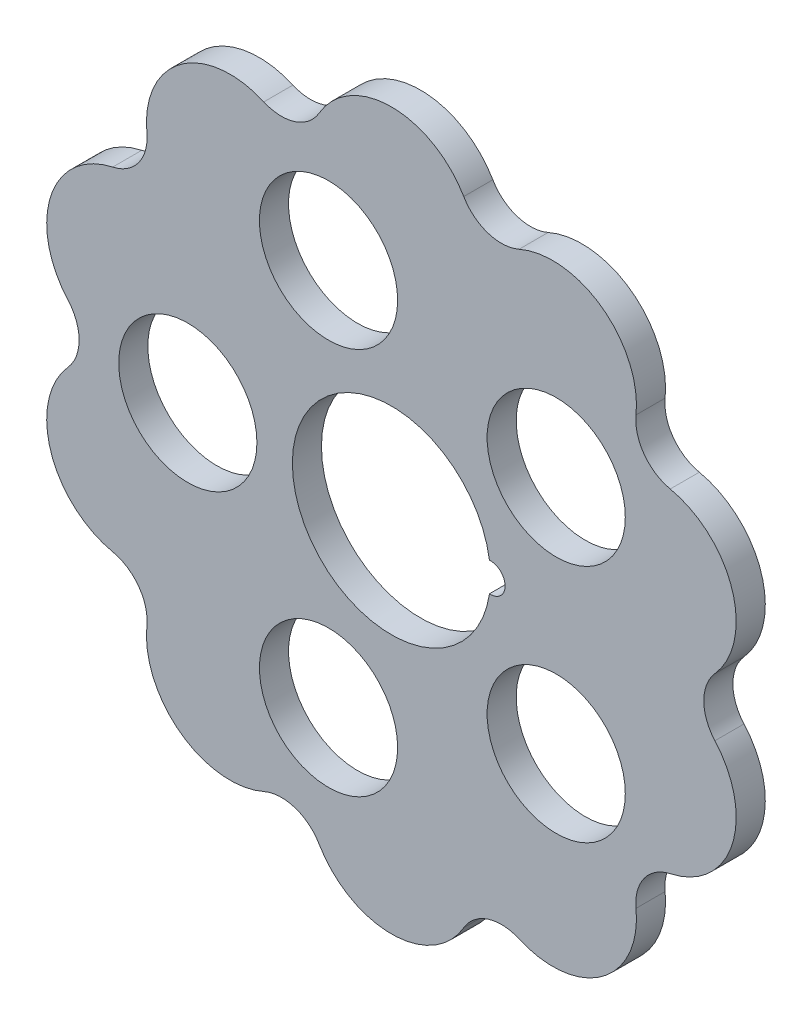
ISO-10303-21;
HEADER;
FILE_DESCRIPTION(('STEP AP214'),'2;1');
FILE_NAME('part.step','',(''),(''),'','','');
FILE_SCHEMA(('AUTOMOTIVE_DESIGN { 1 0 10303 214 1 1 1 1 }'));
ENDSEC;
DATA;
#1=APPLICATION_CONTEXT('core data for automotive mechanical design processes');
#2=APPLICATION_PROTOCOL_DEFINITION('international standard','automotive_design',2000,#1);
#3=PRODUCT_CONTEXT('',#1,'mechanical');
#4=PRODUCT('Part','Part','',(#3));
#5=PRODUCT_RELATED_PRODUCT_CATEGORY('part','',(#4));
#6=PRODUCT_DEFINITION_FORMATION('','',#4);
#7=PRODUCT_DEFINITION_CONTEXT('part definition',#1,'design');
#8=PRODUCT_DEFINITION('design','',#6,#7);
#9=PRODUCT_DEFINITION_SHAPE('','',#8);
#10=(LENGTH_UNIT() NAMED_UNIT(*) SI_UNIT(.MILLI.,.METRE.));
#11=(NAMED_UNIT(*) PLANE_ANGLE_UNIT() SI_UNIT($,.RADIAN.));
#12=(NAMED_UNIT(*) SI_UNIT($,.STERADIAN.) SOLID_ANGLE_UNIT());
#13=UNCERTAINTY_MEASURE_WITH_UNIT(LENGTH_MEASURE(1.E-05),#10,'distance_accuracy_value','');
#14=(GEOMETRIC_REPRESENTATION_CONTEXT(3) GLOBAL_UNCERTAINTY_ASSIGNED_CONTEXT((#13)) GLOBAL_UNIT_ASSIGNED_CONTEXT((#10,
#11,#12)) REPRESENTATION_CONTEXT('',''));
#15=CARTESIAN_POINT('',(0.,0.,0.));
#16=DIRECTION('',(0.,0.,1.));
#17=DIRECTION('',(1.,0.,0.));
#18=AXIS2_PLACEMENT_3D('',#15,#16,#17);
#19=CARTESIAN_POINT('',(-7.562766619413,-35.3384152774416,4.));
#20=DIRECTION('',(0.,0.,-1.));
#21=DIRECTION('',(-1.,0.,0.));
#22=AXIS2_PLACEMENT_3D('',#19,#20,#21);
#23=PLANE('',#22);
#24=CARTESIAN_POINT('',(-15.125533238826,-39.7392175975071,4.));
#25=DIRECTION('',(0.,0.,-1.));
#26=DIRECTION('',(-1.,0.,0.));
#27=AXIS2_PLACEMENT_3D('',#24,#25,#26);
#28=CIRCLE('',#27,5.99999999999993);
#29=CARTESIAN_POINT('',(-17.5472566794711,-34.2496588195152,4.));
#30=VERTEX_POINT('',#29);
#31=CARTESIAN_POINT('',(-9.93963612837122,-36.7215245780338,4.));
#32=VERTEX_POINT('',#31);
#33=EDGE_CURVE('E256',#30,#32,#28,.T.);
#34=ORIENTED_EDGE('',*,*,#33,.T.);
#35=CARTESIAN_POINT('',(0.,-30.9376129573762,4.));
#36=DIRECTION('',(0.,0.,1.));
#37=DIRECTION('',(1.,0.,0.));
#38=AXIS2_PLACEMENT_3D('',#35,#36,#37);
#39=CIRCLE('',#38,11.5);
#40=CARTESIAN_POINT('',(9.93963612837114,-36.7215245780338,4.));
#41=VERTEX_POINT('',#40);
#42=EDGE_CURVE('E137',#32,#41,#39,.T.);
#43=ORIENTED_EDGE('',*,*,#42,.T.);
#44=CARTESIAN_POINT('',(15.1255332388255,-39.7392175975072,4.));
#45=DIRECTION('',(0.,0.,-1.));
#46=DIRECTION('',(-1.,0.,0.));
#47=AXIS2_PLACEMENT_3D('',#44,#45,#46);
#48=CIRCLE('',#47,5.9999999999998);
#49=CARTESIAN_POINT('',(17.5472566794707,-34.2496588195154,4.));
#50=VERTEX_POINT('',#49);
#51=EDGE_CURVE('E335',#41,#50,#48,.T.);
#52=ORIENTED_EDGE('',*,*,#51,.T.);
#53=CARTESIAN_POINT('',(22.1888932740404,-23.7280044950307,4.));
#54=DIRECTION('',(0.,0.,1.));
#55=DIRECTION('',(1.,0.,0.));
#56=AXIS2_PLACEMENT_3D('',#53,#54,#55);
#57=CIRCLE('',#56,11.4999999999999);
#58=CARTESIAN_POINT('',(33.6299257709814,-22.5649157606956,4.));
#59=VERTEX_POINT('',#58);
#60=EDGE_CURVE('E337',#50,#59,#57,.T.);
#61=ORIENTED_EDGE('',*,*,#60,.T.);
#62=CARTESIAN_POINT('',(39.5991601172115,-21.9580868558251,4.));
#63=DIRECTION('',(0.,0.,-1.));
#64=DIRECTION('',(-1.,0.,0.));
#65=AXIS2_PLACEMENT_3D('',#62,#63,#64);
#66=CIRCLE('',#65,5.99999999999993);
#67=CARTESIAN_POINT('',(38.3316938450736,-16.0934871892671,4.));
#68=VERTEX_POINT('',#67);
#69=EDGE_CURVE('E339',#59,#68,#66,.T.);
#70=ORIENTED_EDGE('',*,*,#69,.T.);
#71=CARTESIAN_POINT('',(35.9023834901419,-4.85300449503085,4.));
#72=DIRECTION('',(0.,0.,1.));
#73=DIRECTION('',(1.,0.,0.));
#74=AXIS2_PLACEMENT_3D('',#71,#72,#73);
#75=CIRCLE('',#74,11.5);
#76=CARTESIAN_POINT('',(44.4747268082136,2.81282422971325,4.));
#77=VERTEX_POINT('',#76);
#78=EDGE_CURVE('E341',#68,#77,#75,.T.);
#79=ORIENTED_EDGE('',*,*,#78,.T.);
#80=CARTESIAN_POINT('',(48.9472537567725,6.81238704262311,4.));
#81=DIRECTION('',(0.,0.,-1.));
#82=DIRECTION('',(-1.,0.,0.));
#83=AXIS2_PLACEMENT_3D('',#80,#81,#82);
#84=CIRCLE('',#83,5.99999999999993);
#85=CARTESIAN_POINT('',(44.4747268082138,10.8119498555334,4.));
#86=VERTEX_POINT('',#85);
#87=EDGE_CURVE('E343',#77,#86,#84,.T.);
#88=ORIENTED_EDGE('',*,*,#87,.T.);
#89=CARTESIAN_POINT('',(35.9023834901421,18.4777785802777,4.));
#90=DIRECTION('',(0.,0.,1.));
#91=DIRECTION('',(1.,0.,0.));
#92=AXIS2_PLACEMENT_3D('',#89,#90,#91);
#93=CIRCLE('',#92,11.5);
#94=CARTESIAN_POINT('',(38.331693845074,29.7182612745138,4.));
#95=VERTEX_POINT('',#94);
#96=EDGE_CURVE('E345',#86,#95,#93,.T.);
#97=ORIENTED_EDGE('',*,*,#96,.T.);
#98=CARTESIAN_POINT('',(39.5991601172123,35.5828609410716,4.));
#99=DIRECTION('',(0.,0.,-1.));
#100=DIRECTION('',(-1.,0.,0.));
#101=AXIS2_PLACEMENT_3D('',#98,#99,#100);
#102=CIRCLE('',#101,5.99999999999992);
#103=CARTESIAN_POINT('',(33.6299257709823,36.1896898459425,4.));
#104=VERTEX_POINT('',#103);
#105=EDGE_CURVE('E347',#95,#104,#102,.T.);
#106=ORIENTED_EDGE('',*,*,#105,.T.);
#107=CARTESIAN_POINT('',(22.1888932740411,37.3527785802779,4.));
#108=DIRECTION('',(0.,0.,1.));
#109=DIRECTION('',(1.,0.,0.));
#110=AXIS2_PLACEMENT_3D('',#107,#108,#109);
#111=CIRCLE('',#110,11.5);
#112=CARTESIAN_POINT('',(17.5472566794713,47.8744329047627,4.));
#113=VERTEX_POINT('',#112);
#114=EDGE_CURVE('E349',#104,#113,#111,.T.);
#115=ORIENTED_EDGE('',*,*,#114,.T.);
#116=CARTESIAN_POINT('',(15.1255332388262,53.3639916827546,4.));
#117=DIRECTION('',(0.,0.,-1.));
#118=DIRECTION('',(-1.,0.,0.));
#119=AXIS2_PLACEMENT_3D('',#116,#117,#118);
#120=CIRCLE('',#119,5.99999999999993);
#121=CARTESIAN_POINT('',(9.93963612837156,50.3462986632815,4.));
#122=VERTEX_POINT('',#121);
#123=EDGE_CURVE('E351',#113,#122,#120,.T.);
#124=ORIENTED_EDGE('',*,*,#123,.T.);
#125=CARTESIAN_POINT('',(2.2891237156312E-13,44.5623870426238,4.));
#126=DIRECTION('',(0.,0.,1.));
#127=DIRECTION('',(1.,0.,0.));
#128=AXIS2_PLACEMENT_3D('',#125,#126,#127);
#129=CIRCLE('',#128,11.5);
#130=CARTESIAN_POINT('',(-9.93963612837091,50.3462986632815,4.));
#131=VERTEX_POINT('',#130);
#132=EDGE_CURVE('E353',#122,#131,#129,.T.);
#133=ORIENTED_EDGE('',*,*,#132,.T.);
#134=CARTESIAN_POINT('',(-15.1255332388253,53.363991682755,4.));
#135=DIRECTION('',(0.,0.,-1.));
#136=DIRECTION('',(-1.,0.,0.));
#137=AXIS2_PLACEMENT_3D('',#134,#135,#136);
#138=CIRCLE('',#137,5.99999999999992);
#139=CARTESIAN_POINT('',(-17.5472566794707,47.8744329047631,4.));
#140=VERTEX_POINT('',#139);
#141=EDGE_CURVE('E355',#131,#140,#138,.T.);
#142=ORIENTED_EDGE('',*,*,#141,.T.);
#143=CARTESIAN_POINT('',(-22.1888932740407,37.3527785802782,4.));
#144=DIRECTION('',(0.,0.,1.));
#145=DIRECTION('',(1.,0.,0.));
#146=AXIS2_PLACEMENT_3D('',#143,#144,#145);
#147=CIRCLE('',#146,11.5);
#148=CARTESIAN_POINT('',(-33.6299257709818,36.189689845943,4.));
#149=VERTEX_POINT('',#148);
#150=EDGE_CURVE('E357',#140,#149,#147,.T.);
#151=ORIENTED_EDGE('',*,*,#150,.T.);
#152=CARTESIAN_POINT('',(-39.5991601172118,35.5828609410724,4.));
#153=DIRECTION('',(0.,0.,-1.));
#154=DIRECTION('',(-1.,0.,0.));
#155=AXIS2_PLACEMENT_3D('',#152,#153,#154);
#156=CIRCLE('',#155,5.99999999999992);
#157=CARTESIAN_POINT('',(-38.3316938450738,29.7182612745145,4.));
#158=VERTEX_POINT('',#157);
#159=EDGE_CURVE('E359',#149,#158,#156,.T.);
#160=ORIENTED_EDGE('',*,*,#159,.T.);
#161=CARTESIAN_POINT('',(-35.902383490142,18.4777785802783,4.));
#162=DIRECTION('',(0.,0.,1.));
#163=DIRECTION('',(1.,0.,0.));
#164=AXIS2_PLACEMENT_3D('',#161,#162,#163);
#165=CIRCLE('',#164,11.5);
#166=CARTESIAN_POINT('',(-44.4747268082137,10.8119498555341,4.));
#167=VERTEX_POINT('',#166);
#168=EDGE_CURVE('E361',#158,#167,#165,.T.);
#169=ORIENTED_EDGE('',*,*,#168,.T.);
#170=CARTESIAN_POINT('',(-48.9472537567726,6.81238704262419,4.));
#171=DIRECTION('',(0.,0.,-1.));
#172=DIRECTION('',(-1.,0.,0.));
#173=AXIS2_PLACEMENT_3D('',#170,#171,#172);
#174=CIRCLE('',#173,5.99999999999992);
#175=CARTESIAN_POINT('',(-44.4747268082138,2.81282422971396,4.));
#176=VERTEX_POINT('',#175);
#177=EDGE_CURVE('E195',#167,#176,#174,.T.);
#178=ORIENTED_EDGE('',*,*,#177,.T.);
#179=CARTESIAN_POINT('',(-35.9023834901421,-4.85300449503034,4.));
#180=DIRECTION('',(0.,0.,1.));
#181=DIRECTION('',(1.,0.,0.));
#182=AXIS2_PLACEMENT_3D('',#179,#180,#181);
#183=CIRCLE('',#182,11.5);
#184=CARTESIAN_POINT('',(-38.331693845074,-16.0934871892664,4.));
#185=VERTEX_POINT('',#184);
#186=EDGE_CURVE('E188',#176,#185,#183,.T.);
#187=ORIENTED_EDGE('',*,*,#186,.T.);
#188=CARTESIAN_POINT('',(-39.5991601172122,-21.9580868558242,4.));
#189=DIRECTION('',(0.,0.,-1.));
#190=DIRECTION('',(-1.,0.,0.));
#191=AXIS2_PLACEMENT_3D('',#188,#189,#190);
#192=CIRCLE('',#191,5.99999999999993);
#193=CARTESIAN_POINT('',(-33.6299257709822,-22.5649157606951,4.));
#194=VERTEX_POINT('',#193);
#195=EDGE_CURVE('E192',#185,#194,#192,.T.);
#196=ORIENTED_EDGE('',*,*,#195,.T.);
#197=CARTESIAN_POINT('',(-22.1888932740409,-23.7280044950304,4.));
#198=DIRECTION('',(0.,0.,1.));
#199=DIRECTION('',(1.,0.,0.));
#200=AXIS2_PLACEMENT_3D('',#197,#198,#199);
#201=CIRCLE('',#200,11.5);
#202=EDGE_CURVE('E59',#194,#30,#201,.T.);
#203=ORIENTED_EDGE('',*,*,#202,.T.);
#204=EDGE_LOOP('',(#34,#43,#52,#61,#70,#79,#88,#97,#106,#115,#124,#133,#142,#151,#160,#169,#178,
#187,#196,#203));
#205=FACE_BOUND('',#204,.T.);
#206=CARTESIAN_POINT('',(0.,6.81238704262382,4.));
#207=DIRECTION('',(0.,0.,1.));
#208=DIRECTION('',(1.,0.,0.));
#209=AXIS2_PLACEMENT_3D('',#206,#207,#208);
#210=CIRCLE('',#209,13.625);
#211=CARTESIAN_POINT('',(13.4782110091743,8.80699301678824,4.));
#212=VERTEX_POINT('',#211);
#213=CARTESIAN_POINT('',(13.4782110091743,4.81778106845941,4.));
#214=VERTEX_POINT('',#213);
#215=EDGE_CURVE('E220',#212,#214,#210,.T.);
#216=ORIENTED_EDGE('',*,*,#215,.F.);
#217=CARTESIAN_POINT('',(13.625,6.81238704262382,4.));
#218=DIRECTION('',(0.,0.,1.));
#219=DIRECTION('',(1.,0.,0.));
#220=AXIS2_PLACEMENT_3D('',#217,#218,#219);
#221=CIRCLE('',#220,2.);
#222=EDGE_CURVE('E50',#214,#212,#221,.T.);
#223=ORIENTED_EDGE('',*,*,#222,.F.);
#224=EDGE_LOOP('',(#216,#223));
#225=FACE_BOUND('',#224,.T.);
#226=CARTESIAN_POINT('',(-8.65247584249868,-19.8171954136404,4.));
#227=DIRECTION('',(0.,0.,1.));
#228=DIRECTION('',(1.,0.,0.));
#229=AXIS2_PLACEMENT_3D('',#226,#227,#228);
#230=CIRCLE('',#229,9.5);
#231=CARTESIAN_POINT('',(0.847524157501315,-19.8171954136404,4.));
#232=VERTEX_POINT('',#231);
#233=EDGE_CURVE('E325',#232,#232,#230,.T.);
#234=ORIENTED_EDGE('',*,*,#233,.F.);
#235=EDGE_LOOP('',(#234));
#236=FACE_BOUND('',#235,.T.);
#237=CARTESIAN_POINT('',(-28.,6.81238704262403,4.));
#238=DIRECTION('',(0.,0.,1.));
#239=DIRECTION('',(1.,0.,0.));
#240=AXIS2_PLACEMENT_3D('',#237,#238,#239);
#241=CIRCLE('',#240,9.5);
#242=CARTESIAN_POINT('',(-18.5,6.81238704262403,4.));
#243=VERTEX_POINT('',#242);
#244=EDGE_CURVE('E707',#243,#243,#241,.T.);
#245=ORIENTED_EDGE('',*,*,#244,.F.);
#246=EDGE_LOOP('',(#245));
#247=FACE_BOUND('',#246,.T.);
#248=CARTESIAN_POINT('',(-8.65247584249829,33.4419694988882,4.));
#249=DIRECTION('',(0.,0.,1.));
#250=DIRECTION('',(1.,0.,0.));
#251=AXIS2_PLACEMENT_3D('',#248,#249,#250);
#252=CIRCLE('',#251,9.5);
#253=CARTESIAN_POINT('',(0.847524157501714,33.4419694988882,4.));
#254=VERTEX_POINT('',#253);
#255=EDGE_CURVE('E701',#254,#254,#252,.T.);
#256=ORIENTED_EDGE('',*,*,#255,.F.);
#257=EDGE_LOOP('',(#256));
#258=FACE_BOUND('',#257,.T.);
#259=CARTESIAN_POINT('',(22.6524758424987,23.2703741068128,4.));
#260=DIRECTION('',(0.,0.,1.));
#261=DIRECTION('',(1.,0.,0.));
#262=AXIS2_PLACEMENT_3D('',#259,#260,#261);
#263=CIRCLE('',#262,9.5);
#264=CARTESIAN_POINT('',(32.1524758424987,23.2703741068128,4.));
#265=VERTEX_POINT('',#264);
#266=EDGE_CURVE('E695',#265,#265,#263,.T.);
#267=ORIENTED_EDGE('',*,*,#266,.F.);
#268=EDGE_LOOP('',(#267));
#269=FACE_BOUND('',#268,.T.);
#270=CARTESIAN_POINT('',(22.6524758424982,-9.64560002156578,4.));
#271=DIRECTION('',(0.,0.,1.));
#272=DIRECTION('',(1.,0.,0.));
#273=AXIS2_PLACEMENT_3D('',#270,#271,#272);
#274=CIRCLE('',#273,9.5);
#275=CARTESIAN_POINT('',(32.1524758424982,-9.64560002156578,4.));
#276=VERTEX_POINT('',#275);
#277=EDGE_CURVE('E686',#276,#276,#274,.T.);
#278=ORIENTED_EDGE('',*,*,#277,.F.);
#279=EDGE_LOOP('',(#278));
#280=FACE_BOUND('',#279,.T.);
#281=ADVANCED_FACE('F36',(#205,#225,#236,#247,#258,#269,#280),#23,.F.);
#282=CARTESIAN_POINT('',(-7.562766619413,-35.3384152774416,0.));
#283=DIRECTION('',(0.,0.,-1.));
#284=DIRECTION('',(-1.,0.,0.));
#285=AXIS2_PLACEMENT_3D('',#282,#283,#284);
#286=PLANE('',#285);
#287=CARTESIAN_POINT('',(13.625,6.81238704262382,0.));
#288=DIRECTION('',(0.,0.,1.));
#289=DIRECTION('',(1.,0.,0.));
#290=AXIS2_PLACEMENT_3D('',#287,#288,#289);
#291=CIRCLE('',#290,2.);
#292=CARTESIAN_POINT('',(13.4782110091743,4.81778106845941,0.));
#293=VERTEX_POINT('',#292);
#294=CARTESIAN_POINT('',(13.4782110091743,8.80699301678824,0.));
#295=VERTEX_POINT('',#294);
#296=EDGE_CURVE('E310',#293,#295,#291,.T.);
#297=ORIENTED_EDGE('',*,*,#296,.T.);
#298=CARTESIAN_POINT('',(0.,6.81238704262382,0.));
#299=DIRECTION('',(0.,0.,1.));
#300=DIRECTION('',(1.,0.,0.));
#301=AXIS2_PLACEMENT_3D('',#298,#299,#300);
#302=CIRCLE('',#301,13.625);
#303=EDGE_CURVE('E321',#295,#293,#302,.T.);
#304=ORIENTED_EDGE('',*,*,#303,.T.);
#305=EDGE_LOOP('',(#297,#304));
#306=FACE_BOUND('',#305,.T.);
#307=CARTESIAN_POINT('',(22.6524758424987,23.2703741068128,0.));
#308=DIRECTION('',(0.,0.,1.));
#309=DIRECTION('',(1.,0.,0.));
#310=AXIS2_PLACEMENT_3D('',#307,#308,#309);
#311=CIRCLE('',#310,9.5);
#312=CARTESIAN_POINT('',(32.1524758424987,23.2703741068128,0.));
#313=VERTEX_POINT('',#312);
#314=EDGE_CURVE('E691',#313,#313,#311,.T.);
#315=ORIENTED_EDGE('',*,*,#314,.T.);
#316=EDGE_LOOP('',(#315));
#317=FACE_BOUND('',#316,.T.);
#318=CARTESIAN_POINT('',(-28.,6.81238704262403,0.));
#319=DIRECTION('',(0.,0.,1.));
#320=DIRECTION('',(1.,0.,0.));
#321=AXIS2_PLACEMENT_3D('',#318,#319,#320);
#322=CIRCLE('',#321,9.5);
#323=CARTESIAN_POINT('',(-18.5,6.81238704262403,0.));
#324=VERTEX_POINT('',#323);
#325=EDGE_CURVE('E704',#324,#324,#322,.T.);
#326=ORIENTED_EDGE('',*,*,#325,.T.);
#327=EDGE_LOOP('',(#326));
#328=FACE_BOUND('',#327,.T.);
#329=CARTESIAN_POINT('',(-15.125533238826,-39.7392175975071,0.));
#330=DIRECTION('',(0.,0.,-1.));
#331=DIRECTION('',(-1.,0.,0.));
#332=AXIS2_PLACEMENT_3D('',#329,#330,#331);
#333=CIRCLE('',#332,5.99999999999993);
#334=CARTESIAN_POINT('',(-17.5472566794711,-34.2496588195152,0.));
#335=VERTEX_POINT('',#334);
#336=CARTESIAN_POINT('',(-9.93963612837122,-36.7215245780338,0.));
#337=VERTEX_POINT('',#336);
#338=EDGE_CURVE('E216',#335,#337,#333,.T.);
#339=ORIENTED_EDGE('',*,*,#338,.F.);
#340=CARTESIAN_POINT('',(-22.1888932740409,-23.7280044950304,0.));
#341=DIRECTION('',(0.,0.,1.));
#342=DIRECTION('',(1.,0.,0.));
#343=AXIS2_PLACEMENT_3D('',#340,#341,#342);
#344=CIRCLE('',#343,11.5);
#345=CARTESIAN_POINT('',(-33.6299257709822,-22.5649157606951,0.));
#346=VERTEX_POINT('',#345);
#347=EDGE_CURVE('E128',#346,#335,#344,.T.);
#348=ORIENTED_EDGE('',*,*,#347,.F.);
#349=CARTESIAN_POINT('',(-39.5991601172122,-21.9580868558242,0.));
#350=DIRECTION('',(0.,0.,-1.));
#351=DIRECTION('',(-1.,0.,0.));
#352=AXIS2_PLACEMENT_3D('',#349,#350,#351);
#353=CIRCLE('',#352,5.99999999999993);
#354=CARTESIAN_POINT('',(-38.331693845074,-16.0934871892664,0.));
#355=VERTEX_POINT('',#354);
#356=EDGE_CURVE('E253',#355,#346,#353,.T.);
#357=ORIENTED_EDGE('',*,*,#356,.F.);
#358=CARTESIAN_POINT('',(-35.9023834901421,-4.85300449503034,0.));
#359=DIRECTION('',(0.,0.,1.));
#360=DIRECTION('',(1.,0.,0.));
#361=AXIS2_PLACEMENT_3D('',#358,#359,#360);
#362=CIRCLE('',#361,11.5);
#363=CARTESIAN_POINT('',(-44.4747268082138,2.81282422971396,0.));
#364=VERTEX_POINT('',#363);
#365=EDGE_CURVE('E204',#364,#355,#362,.T.);
#366=ORIENTED_EDGE('',*,*,#365,.F.);
#367=CARTESIAN_POINT('',(-48.9472537567726,6.81238704262419,0.));
#368=DIRECTION('',(0.,0.,-1.));
#369=DIRECTION('',(-1.,0.,0.));
#370=AXIS2_PLACEMENT_3D('',#367,#368,#369);
#371=CIRCLE('',#370,5.99999999999992);
#372=CARTESIAN_POINT('',(-44.4747268082137,10.8119498555341,0.));
#373=VERTEX_POINT('',#372);
#374=EDGE_CURVE('E250',#373,#364,#371,.T.);
#375=ORIENTED_EDGE('',*,*,#374,.F.);
#376=CARTESIAN_POINT('',(-35.902383490142,18.4777785802783,0.));
#377=DIRECTION('',(0.,0.,1.));
#378=DIRECTION('',(1.,0.,0.));
#379=AXIS2_PLACEMENT_3D('',#376,#377,#378);
#380=CIRCLE('',#379,11.5);
#381=CARTESIAN_POINT('',(-38.3316938450738,29.7182612745145,0.));
#382=VERTEX_POINT('',#381);
#383=EDGE_CURVE('E248',#382,#373,#380,.T.);
#384=ORIENTED_EDGE('',*,*,#383,.F.);
#385=CARTESIAN_POINT('',(-39.5991601172118,35.5828609410724,0.));
#386=DIRECTION('',(0.,0.,-1.));
#387=DIRECTION('',(-1.,0.,0.));
#388=AXIS2_PLACEMENT_3D('',#385,#386,#387);
#389=CIRCLE('',#388,5.99999999999992);
#390=CARTESIAN_POINT('',(-33.6299257709818,36.189689845943,0.));
#391=VERTEX_POINT('',#390);
#392=EDGE_CURVE('E246',#391,#382,#389,.T.);
#393=ORIENTED_EDGE('',*,*,#392,.F.);
#394=CARTESIAN_POINT('',(-22.1888932740407,37.3527785802782,0.));
#395=DIRECTION('',(0.,0.,1.));
#396=DIRECTION('',(1.,0.,0.));
#397=AXIS2_PLACEMENT_3D('',#394,#395,#396);
#398=CIRCLE('',#397,11.5);
#399=CARTESIAN_POINT('',(-17.5472566794707,47.8744329047631,0.));
#400=VERTEX_POINT('',#399);
#401=EDGE_CURVE('E244',#400,#391,#398,.T.);
#402=ORIENTED_EDGE('',*,*,#401,.F.);
#403=CARTESIAN_POINT('',(-15.1255332388253,53.363991682755,0.));
#404=DIRECTION('',(0.,0.,-1.));
#405=DIRECTION('',(-1.,0.,0.));
#406=AXIS2_PLACEMENT_3D('',#403,#404,#405);
#407=CIRCLE('',#406,5.99999999999992);
#408=CARTESIAN_POINT('',(-9.93963612837091,50.3462986632815,0.));
#409=VERTEX_POINT('',#408);
#410=EDGE_CURVE('E242',#409,#400,#407,.T.);
#411=ORIENTED_EDGE('',*,*,#410,.F.);
#412=CARTESIAN_POINT('',(2.2891237156312E-13,44.5623870426238,0.));
#413=DIRECTION('',(0.,0.,1.));
#414=DIRECTION('',(1.,0.,0.));
#415=AXIS2_PLACEMENT_3D('',#412,#413,#414);
#416=CIRCLE('',#415,11.5);
#417=CARTESIAN_POINT('',(9.93963612837156,50.3462986632815,0.));
#418=VERTEX_POINT('',#417);
#419=EDGE_CURVE('E240',#418,#409,#416,.T.);
#420=ORIENTED_EDGE('',*,*,#419,.F.);
#421=CARTESIAN_POINT('',(15.1255332388262,53.3639916827546,0.));
#422=DIRECTION('',(0.,0.,-1.));
#423=DIRECTION('',(-1.,0.,0.));
#424=AXIS2_PLACEMENT_3D('',#421,#422,#423);
#425=CIRCLE('',#424,5.99999999999993);
#426=CARTESIAN_POINT('',(17.5472566794713,47.8744329047627,0.));
#427=VERTEX_POINT('',#426);
#428=EDGE_CURVE('E238',#427,#418,#425,.T.);
#429=ORIENTED_EDGE('',*,*,#428,.F.);
#430=CARTESIAN_POINT('',(22.1888932740411,37.3527785802779,0.));
#431=DIRECTION('',(0.,0.,1.));
#432=DIRECTION('',(1.,0.,0.));
#433=AXIS2_PLACEMENT_3D('',#430,#431,#432);
#434=CIRCLE('',#433,11.5);
#435=CARTESIAN_POINT('',(33.6299257709823,36.1896898459425,0.));
#436=VERTEX_POINT('',#435);
#437=EDGE_CURVE('E236',#436,#427,#434,.T.);
#438=ORIENTED_EDGE('',*,*,#437,.F.);
#439=CARTESIAN_POINT('',(39.5991601172123,35.5828609410716,0.));
#440=DIRECTION('',(0.,0.,-1.));
#441=DIRECTION('',(-1.,0.,0.));
#442=AXIS2_PLACEMENT_3D('',#439,#440,#441);
#443=CIRCLE('',#442,5.99999999999992);
#444=CARTESIAN_POINT('',(38.331693845074,29.7182612745138,0.));
#445=VERTEX_POINT('',#444);
#446=EDGE_CURVE('E234',#445,#436,#443,.T.);
#447=ORIENTED_EDGE('',*,*,#446,.F.);
#448=CARTESIAN_POINT('',(35.9023834901421,18.4777785802777,0.));
#449=DIRECTION('',(0.,0.,1.));
#450=DIRECTION('',(1.,0.,0.));
#451=AXIS2_PLACEMENT_3D('',#448,#449,#450);
#452=CIRCLE('',#451,11.5);
#453=CARTESIAN_POINT('',(44.4747268082138,10.8119498555334,0.));
#454=VERTEX_POINT('',#453);
#455=EDGE_CURVE('E232',#454,#445,#452,.T.);
#456=ORIENTED_EDGE('',*,*,#455,.F.);
#457=CARTESIAN_POINT('',(48.9472537567725,6.81238704262311,0.));
#458=DIRECTION('',(0.,0.,-1.));
#459=DIRECTION('',(-1.,0.,0.));
#460=AXIS2_PLACEMENT_3D('',#457,#458,#459);
#461=CIRCLE('',#460,5.99999999999993);
#462=CARTESIAN_POINT('',(44.4747268082136,2.81282422971325,0.));
#463=VERTEX_POINT('',#462);
#464=EDGE_CURVE('E230',#463,#454,#461,.T.);
#465=ORIENTED_EDGE('',*,*,#464,.F.);
#466=CARTESIAN_POINT('',(35.9023834901419,-4.85300449503085,0.));
#467=DIRECTION('',(0.,0.,1.));
#468=DIRECTION('',(1.,0.,0.));
#469=AXIS2_PLACEMENT_3D('',#466,#467,#468);
#470=CIRCLE('',#469,11.5);
#471=CARTESIAN_POINT('',(38.3316938450736,-16.0934871892671,0.));
#472=VERTEX_POINT('',#471);
#473=EDGE_CURVE('E228',#472,#463,#470,.T.);
#474=ORIENTED_EDGE('',*,*,#473,.F.);
#475=CARTESIAN_POINT('',(39.5991601172115,-21.9580868558251,0.));
#476=DIRECTION('',(0.,0.,-1.));
#477=DIRECTION('',(-1.,0.,0.));
#478=AXIS2_PLACEMENT_3D('',#475,#476,#477);
#479=CIRCLE('',#478,5.99999999999993);
#480=CARTESIAN_POINT('',(33.6299257709814,-22.5649157606956,0.));
#481=VERTEX_POINT('',#480);
#482=EDGE_CURVE('E226',#481,#472,#479,.T.);
#483=ORIENTED_EDGE('',*,*,#482,.F.);
#484=CARTESIAN_POINT('',(22.1888932740404,-23.7280044950307,0.));
#485=DIRECTION('',(0.,0.,1.));
#486=DIRECTION('',(1.,0.,0.));
#487=AXIS2_PLACEMENT_3D('',#484,#485,#486);
#488=CIRCLE('',#487,11.4999999999999);
#489=CARTESIAN_POINT('',(17.5472566794707,-34.2496588195154,0.));
#490=VERTEX_POINT('',#489);
#491=EDGE_CURVE('E224',#490,#481,#488,.T.);
#492=ORIENTED_EDGE('',*,*,#491,.F.);
#493=CARTESIAN_POINT('',(15.1255332388255,-39.7392175975072,0.));
#494=DIRECTION('',(0.,0.,-1.));
#495=DIRECTION('',(-1.,0.,0.));
#496=AXIS2_PLACEMENT_3D('',#493,#494,#495);
#497=CIRCLE('',#496,5.9999999999998);
#498=CARTESIAN_POINT('',(9.93963612837114,-36.7215245780338,0.));
#499=VERTEX_POINT('',#498);
#500=EDGE_CURVE('E222',#499,#490,#497,.T.);
#501=ORIENTED_EDGE('',*,*,#500,.F.);
#502=CARTESIAN_POINT('',(0.,-30.9376129573762,0.));
#503=DIRECTION('',(0.,0.,1.));
#504=DIRECTION('',(1.,0.,0.));
#505=AXIS2_PLACEMENT_3D('',#502,#503,#504);
#506=CIRCLE('',#505,11.5);
#507=EDGE_CURVE('E219',#337,#499,#506,.T.);
#508=ORIENTED_EDGE('',*,*,#507,.F.);
#509=EDGE_LOOP('',(#339,#348,#357,#366,#375,#384,#393,#402,#411,#420,#429,#438,#447,#456,#465,
#474,#483,#492,#501,#508));
#510=FACE_BOUND('',#509,.T.);
#511=CARTESIAN_POINT('',(-8.65247584249868,-19.8171954136404,0.));
#512=DIRECTION('',(0.,0.,1.));
#513=DIRECTION('',(1.,0.,0.));
#514=AXIS2_PLACEMENT_3D('',#511,#512,#513);
#515=CIRCLE('',#514,9.5);
#516=CARTESIAN_POINT('',(0.847524157501315,-19.8171954136404,0.));
#517=VERTEX_POINT('',#516);
#518=EDGE_CURVE('E329',#517,#517,#515,.T.);
#519=ORIENTED_EDGE('',*,*,#518,.T.);
#520=EDGE_LOOP('',(#519));
#521=FACE_BOUND('',#520,.T.);
#522=CARTESIAN_POINT('',(-8.65247584249829,33.4419694988882,0.));
#523=DIRECTION('',(0.,0.,1.));
#524=DIRECTION('',(1.,0.,0.));
#525=AXIS2_PLACEMENT_3D('',#522,#523,#524);
#526=CIRCLE('',#525,9.5);
#527=CARTESIAN_POINT('',(0.847524157501714,33.4419694988882,0.));
#528=VERTEX_POINT('',#527);
#529=EDGE_CURVE('E698',#528,#528,#526,.T.);
#530=ORIENTED_EDGE('',*,*,#529,.T.);
#531=EDGE_LOOP('',(#530));
#532=FACE_BOUND('',#531,.T.);
#533=CARTESIAN_POINT('',(22.6524758424982,-9.64560002156578,0.));
#534=DIRECTION('',(0.,0.,1.));
#535=DIRECTION('',(1.,0.,0.));
#536=AXIS2_PLACEMENT_3D('',#533,#534,#535);
#537=CIRCLE('',#536,9.5);
#538=CARTESIAN_POINT('',(32.1524758424982,-9.64560002156578,0.));
#539=VERTEX_POINT('',#538);
#540=EDGE_CURVE('E322',#539,#539,#537,.T.);
#541=ORIENTED_EDGE('',*,*,#540,.T.);
#542=EDGE_LOOP('',(#541));
#543=FACE_BOUND('',#542,.T.);
#544=ADVANCED_FACE('F319',(#306,#317,#328,#510,#521,#532,#543),#286,.T.);
#545=CARTESIAN_POINT('',(-15.125533238826,-39.7392175975071,4.));
#546=DIRECTION('',(0.,0.,-1.));
#547=DIRECTION('',(-1.,0.,0.));
#548=AXIS2_PLACEMENT_3D('',#545,#546,#547);
#549=CYLINDRICAL_SURFACE('',#548,5.99999999999993);
#550=ORIENTED_EDGE('',*,*,#338,.T.);
#551=DIRECTION('',(0.,0.,-1.));
#552=VECTOR('',#551,1.);
#553=CARTESIAN_POINT('',(-9.93963612837122,-36.7215245780338,4.));
#554=LINE('',#553,#552);
#555=EDGE_CURVE('E305',#32,#337,#554,.T.);
#556=ORIENTED_EDGE('',*,*,#555,.F.);
#557=ORIENTED_EDGE('',*,*,#33,.F.);
#558=DIRECTION('',(0.,0.,-1.));
#559=VECTOR('',#558,1.);
#560=CARTESIAN_POINT('',(-17.5472566794711,-34.2496588195152,4.));
#561=LINE('',#560,#559);
#562=EDGE_CURVE('E212',#30,#335,#561,.T.);
#563=ORIENTED_EDGE('',*,*,#562,.T.);
#564=EDGE_LOOP('',(#550,#556,#557,#563));
#565=FACE_BOUND('',#564,.T.);
#566=ADVANCED_FACE('F38',(#565),#549,.F.);
#567=CARTESIAN_POINT('',(0.,-30.9376129573762,4.));
#568=DIRECTION('',(0.,0.,-1.));
#569=DIRECTION('',(-1.,0.,0.));
#570=AXIS2_PLACEMENT_3D('',#567,#568,#569);
#571=CYLINDRICAL_SURFACE('',#570,11.5);
#572=ORIENTED_EDGE('',*,*,#507,.T.);
#573=DIRECTION('',(0.,0.,-1.));
#574=VECTOR('',#573,1.);
#575=CARTESIAN_POINT('',(9.93963612837114,-36.7215245780338,4.));
#576=LINE('',#575,#574);
#577=EDGE_CURVE('E302',#41,#499,#576,.T.);
#578=ORIENTED_EDGE('',*,*,#577,.F.);
#579=ORIENTED_EDGE('',*,*,#42,.F.);
#580=ORIENTED_EDGE('',*,*,#555,.T.);
#581=EDGE_LOOP('',(#572,#578,#579,#580));
#582=FACE_BOUND('',#581,.T.);
#583=ADVANCED_FACE('F381',(#582),#571,.T.);
#584=CARTESIAN_POINT('',(15.1255332388255,-39.7392175975072,4.));
#585=DIRECTION('',(0.,0.,-1.));
#586=DIRECTION('',(-1.,0.,0.));
#587=AXIS2_PLACEMENT_3D('',#584,#585,#586);
#588=CYLINDRICAL_SURFACE('',#587,5.9999999999998);
#589=ORIENTED_EDGE('',*,*,#500,.T.);
#590=DIRECTION('',(0.,0.,-1.));
#591=VECTOR('',#590,1.);
#592=CARTESIAN_POINT('',(17.5472566794707,-34.2496588195154,4.));
#593=LINE('',#592,#591);
#594=EDGE_CURVE('E299',#50,#490,#593,.T.);
#595=ORIENTED_EDGE('',*,*,#594,.F.);
#596=ORIENTED_EDGE('',*,*,#51,.F.);
#597=ORIENTED_EDGE('',*,*,#577,.T.);
#598=EDGE_LOOP('',(#589,#595,#596,#597));
#599=FACE_BOUND('',#598,.T.);
#600=ADVANCED_FACE('F384',(#599),#588,.F.);
#601=CARTESIAN_POINT('',(22.1888932740404,-23.7280044950307,4.));
#602=DIRECTION('',(0.,0.,-1.));
#603=DIRECTION('',(-1.,0.,0.));
#604=AXIS2_PLACEMENT_3D('',#601,#602,#603);
#605=CYLINDRICAL_SURFACE('',#604,11.4999999999999);
#606=ORIENTED_EDGE('',*,*,#491,.T.);
#607=DIRECTION('',(0.,0.,-1.));
#608=VECTOR('',#607,1.);
#609=CARTESIAN_POINT('',(33.6299257709814,-22.5649157606956,4.));
#610=LINE('',#609,#608);
#611=EDGE_CURVE('E296',#59,#481,#610,.T.);
#612=ORIENTED_EDGE('',*,*,#611,.F.);
#613=ORIENTED_EDGE('',*,*,#60,.F.);
#614=ORIENTED_EDGE('',*,*,#594,.T.);
#615=EDGE_LOOP('',(#606,#612,#613,#614));
#616=FACE_BOUND('',#615,.T.);
#617=ADVANCED_FACE('F389',(#616),#605,.T.);
#618=CARTESIAN_POINT('',(39.5991601172115,-21.9580868558251,4.));
#619=DIRECTION('',(0.,0.,-1.));
#620=DIRECTION('',(-1.,0.,0.));
#621=AXIS2_PLACEMENT_3D('',#618,#619,#620);
#622=CYLINDRICAL_SURFACE('',#621,5.99999999999993);
#623=ORIENTED_EDGE('',*,*,#482,.T.);
#624=DIRECTION('',(0.,0.,-1.));
#625=VECTOR('',#624,1.);
#626=CARTESIAN_POINT('',(38.3316938450736,-16.0934871892671,4.));
#627=LINE('',#626,#625);
#628=EDGE_CURVE('E293',#68,#472,#627,.T.);
#629=ORIENTED_EDGE('',*,*,#628,.F.);
#630=ORIENTED_EDGE('',*,*,#69,.F.);
#631=ORIENTED_EDGE('',*,*,#611,.T.);
#632=EDGE_LOOP('',(#623,#629,#630,#631));
#633=FACE_BOUND('',#632,.T.);
#634=ADVANCED_FACE('F395',(#633),#622,.F.);
#635=CARTESIAN_POINT('',(35.9023834901419,-4.85300449503085,4.));
#636=DIRECTION('',(0.,0.,-1.));
#637=DIRECTION('',(-1.,0.,0.));
#638=AXIS2_PLACEMENT_3D('',#635,#636,#637);
#639=CYLINDRICAL_SURFACE('',#638,11.5);
#640=ORIENTED_EDGE('',*,*,#473,.T.);
#641=DIRECTION('',(0.,0.,-1.));
#642=VECTOR('',#641,1.);
#643=CARTESIAN_POINT('',(44.4747268082136,2.81282422971325,4.));
#644=LINE('',#643,#642);
#645=EDGE_CURVE('E290',#77,#463,#644,.T.);
#646=ORIENTED_EDGE('',*,*,#645,.F.);
#647=ORIENTED_EDGE('',*,*,#78,.F.);
#648=ORIENTED_EDGE('',*,*,#628,.T.);
#649=EDGE_LOOP('',(#640,#646,#647,#648));
#650=FACE_BOUND('',#649,.T.);
#651=ADVANCED_FACE('F399',(#650),#639,.T.);
#652=CARTESIAN_POINT('',(48.9472537567725,6.81238704262311,4.));
#653=DIRECTION('',(0.,0.,-1.));
#654=DIRECTION('',(-1.,0.,0.));
#655=AXIS2_PLACEMENT_3D('',#652,#653,#654);
#656=CYLINDRICAL_SURFACE('',#655,5.99999999999993);
#657=ORIENTED_EDGE('',*,*,#464,.T.);
#658=DIRECTION('',(0.,0.,-1.));
#659=VECTOR('',#658,1.);
#660=CARTESIAN_POINT('',(44.4747268082138,10.8119498555334,4.));
#661=LINE('',#660,#659);
#662=EDGE_CURVE('E287',#86,#454,#661,.T.);
#663=ORIENTED_EDGE('',*,*,#662,.F.);
#664=ORIENTED_EDGE('',*,*,#87,.F.);
#665=ORIENTED_EDGE('',*,*,#645,.T.);
#666=EDGE_LOOP('',(#657,#663,#664,#665));
#667=FACE_BOUND('',#666,.T.);
#668=ADVANCED_FACE('F404',(#667),#656,.F.);
#669=CARTESIAN_POINT('',(35.9023834901421,18.4777785802777,4.));
#670=DIRECTION('',(0.,0.,-1.));
#671=DIRECTION('',(-1.,0.,0.));
#672=AXIS2_PLACEMENT_3D('',#669,#670,#671);
#673=CYLINDRICAL_SURFACE('',#672,11.5);
#674=ORIENTED_EDGE('',*,*,#455,.T.);
#675=DIRECTION('',(0.,0.,-1.));
#676=VECTOR('',#675,1.);
#677=CARTESIAN_POINT('',(38.331693845074,29.7182612745138,4.));
#678=LINE('',#677,#676);
#679=EDGE_CURVE('E284',#95,#445,#678,.T.);
#680=ORIENTED_EDGE('',*,*,#679,.F.);
#681=ORIENTED_EDGE('',*,*,#96,.F.);
#682=ORIENTED_EDGE('',*,*,#662,.T.);
#683=EDGE_LOOP('',(#674,#680,#681,#682));
#684=FACE_BOUND('',#683,.T.);
#685=ADVANCED_FACE('F410',(#684),#673,.T.);
#686=CARTESIAN_POINT('',(39.5991601172123,35.5828609410716,4.));
#687=DIRECTION('',(0.,0.,-1.));
#688=DIRECTION('',(-1.,0.,0.));
#689=AXIS2_PLACEMENT_3D('',#686,#687,#688);
#690=CYLINDRICAL_SURFACE('',#689,5.99999999999992);
#691=ORIENTED_EDGE('',*,*,#446,.T.);
#692=DIRECTION('',(0.,0.,-1.));
#693=VECTOR('',#692,1.);
#694=CARTESIAN_POINT('',(33.6299257709823,36.1896898459425,4.));
#695=LINE('',#694,#693);
#696=EDGE_CURVE('E281',#104,#436,#695,.T.);
#697=ORIENTED_EDGE('',*,*,#696,.F.);
#698=ORIENTED_EDGE('',*,*,#105,.F.);
#699=ORIENTED_EDGE('',*,*,#679,.T.);
#700=EDGE_LOOP('',(#691,#697,#698,#699));
#701=FACE_BOUND('',#700,.T.);
#702=ADVANCED_FACE('F414',(#701),#690,.F.);
#703=CARTESIAN_POINT('',(22.1888932740411,37.3527785802779,4.));
#704=DIRECTION('',(0.,0.,-1.));
#705=DIRECTION('',(-1.,0.,0.));
#706=AXIS2_PLACEMENT_3D('',#703,#704,#705);
#707=CYLINDRICAL_SURFACE('',#706,11.5);
#708=ORIENTED_EDGE('',*,*,#437,.T.);
#709=DIRECTION('',(0.,0.,-1.));
#710=VECTOR('',#709,1.);
#711=CARTESIAN_POINT('',(17.5472566794713,47.8744329047627,4.));
#712=LINE('',#711,#710);
#713=EDGE_CURVE('E278',#113,#427,#712,.T.);
#714=ORIENTED_EDGE('',*,*,#713,.F.);
#715=ORIENTED_EDGE('',*,*,#114,.F.);
#716=ORIENTED_EDGE('',*,*,#696,.T.);
#717=EDGE_LOOP('',(#708,#714,#715,#716));
#718=FACE_BOUND('',#717,.T.);
#719=ADVANCED_FACE('F419',(#718),#707,.T.);
#720=CARTESIAN_POINT('',(15.1255332388262,53.3639916827546,4.));
#721=DIRECTION('',(0.,0.,-1.));
#722=DIRECTION('',(-1.,0.,0.));
#723=AXIS2_PLACEMENT_3D('',#720,#721,#722);
#724=CYLINDRICAL_SURFACE('',#723,5.99999999999993);
#725=ORIENTED_EDGE('',*,*,#428,.T.);
#726=DIRECTION('',(0.,0.,-1.));
#727=VECTOR('',#726,1.);
#728=CARTESIAN_POINT('',(9.93963612837156,50.3462986632815,4.));
#729=LINE('',#728,#727);
#730=EDGE_CURVE('E275',#122,#418,#729,.T.);
#731=ORIENTED_EDGE('',*,*,#730,.F.);
#732=ORIENTED_EDGE('',*,*,#123,.F.);
#733=ORIENTED_EDGE('',*,*,#713,.T.);
#734=EDGE_LOOP('',(#725,#731,#732,#733));
#735=FACE_BOUND('',#734,.T.);
#736=ADVANCED_FACE('F425',(#735),#724,.F.);
#737=CARTESIAN_POINT('',(2.2891237156312E-13,44.5623870426238,4.));
#738=DIRECTION('',(0.,0.,-1.));
#739=DIRECTION('',(-1.,0.,0.));
#740=AXIS2_PLACEMENT_3D('',#737,#738,#739);
#741=CYLINDRICAL_SURFACE('',#740,11.5);
#742=ORIENTED_EDGE('',*,*,#419,.T.);
#743=DIRECTION('',(0.,0.,-1.));
#744=VECTOR('',#743,1.);
#745=CARTESIAN_POINT('',(-9.93963612837091,50.3462986632815,4.));
#746=LINE('',#745,#744);
#747=EDGE_CURVE('E272',#131,#409,#746,.T.);
#748=ORIENTED_EDGE('',*,*,#747,.F.);
#749=ORIENTED_EDGE('',*,*,#132,.F.);
#750=ORIENTED_EDGE('',*,*,#730,.T.);
#751=EDGE_LOOP('',(#742,#748,#749,#750));
#752=FACE_BOUND('',#751,.T.);
#753=ADVANCED_FACE('F429',(#752),#741,.T.);
#754=CARTESIAN_POINT('',(-15.1255332388253,53.363991682755,4.));
#755=DIRECTION('',(0.,0.,-1.));
#756=DIRECTION('',(-1.,0.,0.));
#757=AXIS2_PLACEMENT_3D('',#754,#755,#756);
#758=CYLINDRICAL_SURFACE('',#757,5.99999999999992);
#759=ORIENTED_EDGE('',*,*,#410,.T.);
#760=DIRECTION('',(0.,0.,-1.));
#761=VECTOR('',#760,1.);
#762=CARTESIAN_POINT('',(-17.5472566794707,47.8744329047631,4.));
#763=LINE('',#762,#761);
#764=EDGE_CURVE('E269',#140,#400,#763,.T.);
#765=ORIENTED_EDGE('',*,*,#764,.F.);
#766=ORIENTED_EDGE('',*,*,#141,.F.);
#767=ORIENTED_EDGE('',*,*,#747,.T.);
#768=EDGE_LOOP('',(#759,#765,#766,#767));
#769=FACE_BOUND('',#768,.T.);
#770=ADVANCED_FACE('F434',(#769),#758,.F.);
#771=CARTESIAN_POINT('',(-22.1888932740407,37.3527785802782,4.));
#772=DIRECTION('',(0.,0.,-1.));
#773=DIRECTION('',(-1.,0.,0.));
#774=AXIS2_PLACEMENT_3D('',#771,#772,#773);
#775=CYLINDRICAL_SURFACE('',#774,11.5);
#776=ORIENTED_EDGE('',*,*,#401,.T.);
#777=DIRECTION('',(0.,0.,-1.));
#778=VECTOR('',#777,1.);
#779=CARTESIAN_POINT('',(-33.6299257709818,36.189689845943,4.));
#780=LINE('',#779,#778);
#781=EDGE_CURVE('E266',#149,#391,#780,.T.);
#782=ORIENTED_EDGE('',*,*,#781,.F.);
#783=ORIENTED_EDGE('',*,*,#150,.F.);
#784=ORIENTED_EDGE('',*,*,#764,.T.);
#785=EDGE_LOOP('',(#776,#782,#783,#784));
#786=FACE_BOUND('',#785,.T.);
#787=ADVANCED_FACE('F438',(#786),#775,.T.);
#788=CARTESIAN_POINT('',(-39.5991601172118,35.5828609410724,4.));
#789=DIRECTION('',(0.,0.,-1.));
#790=DIRECTION('',(-1.,0.,0.));
#791=AXIS2_PLACEMENT_3D('',#788,#789,#790);
#792=CYLINDRICAL_SURFACE('',#791,5.99999999999992);
#793=ORIENTED_EDGE('',*,*,#392,.T.);
#794=DIRECTION('',(0.,0.,-1.));
#795=VECTOR('',#794,1.);
#796=CARTESIAN_POINT('',(-38.3316938450738,29.7182612745145,4.));
#797=LINE('',#796,#795);
#798=EDGE_CURVE('E263',#158,#382,#797,.T.);
#799=ORIENTED_EDGE('',*,*,#798,.F.);
#800=ORIENTED_EDGE('',*,*,#159,.F.);
#801=ORIENTED_EDGE('',*,*,#781,.T.);
#802=EDGE_LOOP('',(#793,#799,#800,#801));
#803=FACE_BOUND('',#802,.T.);
#804=ADVANCED_FACE('F442',(#803),#792,.F.);
#805=CARTESIAN_POINT('',(-35.902383490142,18.4777785802783,4.));
#806=DIRECTION('',(0.,0.,-1.));
#807=DIRECTION('',(-1.,0.,0.));
#808=AXIS2_PLACEMENT_3D('',#805,#806,#807);
#809=CYLINDRICAL_SURFACE('',#808,11.5);
#810=ORIENTED_EDGE('',*,*,#383,.T.);
#811=DIRECTION('',(0.,0.,-1.));
#812=VECTOR('',#811,1.);
#813=CARTESIAN_POINT('',(-44.4747268082137,10.8119498555341,4.));
#814=LINE('',#813,#812);
#815=EDGE_CURVE('E260',#167,#373,#814,.T.);
#816=ORIENTED_EDGE('',*,*,#815,.F.);
#817=ORIENTED_EDGE('',*,*,#168,.F.);
#818=ORIENTED_EDGE('',*,*,#798,.T.);
#819=EDGE_LOOP('',(#810,#816,#817,#818));
#820=FACE_BOUND('',#819,.T.);
#821=ADVANCED_FACE('F367',(#820),#809,.T.);
#822=CARTESIAN_POINT('',(-48.9472537567726,6.81238704262419,4.));
#823=DIRECTION('',(0.,0.,-1.));
#824=DIRECTION('',(-1.,0.,0.));
#825=AXIS2_PLACEMENT_3D('',#822,#823,#824);
#826=CYLINDRICAL_SURFACE('',#825,5.99999999999992);
#827=ORIENTED_EDGE('',*,*,#374,.T.);
#828=DIRECTION('',(0.,0.,-1.));
#829=VECTOR('',#828,1.);
#830=CARTESIAN_POINT('',(-44.4747268082138,2.81282422971396,4.));
#831=LINE('',#830,#829);
#832=EDGE_CURVE('E207',#176,#364,#831,.T.);
#833=ORIENTED_EDGE('',*,*,#832,.F.);
#834=ORIENTED_EDGE('',*,*,#177,.F.);
#835=ORIENTED_EDGE('',*,*,#815,.T.);
#836=EDGE_LOOP('',(#827,#833,#834,#835));
#837=FACE_BOUND('',#836,.T.);
#838=ADVANCED_FACE('F371',(#837),#826,.F.);
#839=CARTESIAN_POINT('',(-35.9023834901421,-4.85300449503034,4.));
#840=DIRECTION('',(0.,0.,-1.));
#841=DIRECTION('',(-1.,0.,0.));
#842=AXIS2_PLACEMENT_3D('',#839,#840,#841);
#843=CYLINDRICAL_SURFACE('',#842,11.5);
#844=ORIENTED_EDGE('',*,*,#365,.T.);
#845=DIRECTION('',(0.,0.,-1.));
#846=VECTOR('',#845,1.);
#847=CARTESIAN_POINT('',(-38.331693845074,-16.0934871892664,4.));
#848=LINE('',#847,#846);
#849=EDGE_CURVE('E201',#185,#355,#848,.T.);
#850=ORIENTED_EDGE('',*,*,#849,.F.);
#851=ORIENTED_EDGE('',*,*,#186,.F.);
#852=ORIENTED_EDGE('',*,*,#832,.T.);
#853=EDGE_LOOP('',(#844,#850,#851,#852));
#854=FACE_BOUND('',#853,.T.);
#855=ADVANCED_FACE('F202',(#854),#843,.T.);
#856=CARTESIAN_POINT('',(-39.5991601172122,-21.9580868558242,4.));
#857=DIRECTION('',(0.,0.,-1.));
#858=DIRECTION('',(-1.,0.,0.));
#859=AXIS2_PLACEMENT_3D('',#856,#857,#858);
#860=CYLINDRICAL_SURFACE('',#859,5.99999999999993);
#861=ORIENTED_EDGE('',*,*,#356,.T.);
#862=DIRECTION('',(0.,0.,-1.));
#863=VECTOR('',#862,1.);
#864=CARTESIAN_POINT('',(-33.6299257709822,-22.5649157606951,4.));
#865=LINE('',#864,#863);
#866=EDGE_CURVE('E208',#194,#346,#865,.T.);
#867=ORIENTED_EDGE('',*,*,#866,.F.);
#868=ORIENTED_EDGE('',*,*,#195,.F.);
#869=ORIENTED_EDGE('',*,*,#849,.T.);
#870=EDGE_LOOP('',(#861,#867,#868,#869));
#871=FACE_BOUND('',#870,.T.);
#872=ADVANCED_FACE('F210',(#871),#860,.F.);
#873=CARTESIAN_POINT('',(-22.1888932740409,-23.7280044950304,4.));
#874=DIRECTION('',(0.,0.,-1.));
#875=DIRECTION('',(-1.,0.,0.));
#876=AXIS2_PLACEMENT_3D('',#873,#874,#875);
#877=CYLINDRICAL_SURFACE('',#876,11.5);
#878=ORIENTED_EDGE('',*,*,#347,.T.);
#879=ORIENTED_EDGE('',*,*,#562,.F.);
#880=ORIENTED_EDGE('',*,*,#202,.F.);
#881=ORIENTED_EDGE('',*,*,#866,.T.);
#882=EDGE_LOOP('',(#878,#879,#880,#881));
#883=FACE_BOUND('',#882,.T.);
#884=ADVANCED_FACE('F375',(#883),#877,.T.);
#885=CARTESIAN_POINT('',(0.,6.81238704262382,4.));
#886=DIRECTION('',(0.,0.,-1.));
#887=DIRECTION('',(-1.,0.,0.));
#888=AXIS2_PLACEMENT_3D('',#885,#886,#887);
#889=CYLINDRICAL_SURFACE('',#888,13.625);
#890=DIRECTION('',(0.,0.,1.));
#891=VECTOR('',#890,1.);
#892=CARTESIAN_POINT('',(13.4782110091743,4.81778106845941,2.));
#893=LINE('',#892,#891);
#894=EDGE_CURVE('E11',#293,#214,#893,.T.);
#895=ORIENTED_EDGE('',*,*,#894,.F.);
#896=ORIENTED_EDGE('',*,*,#303,.F.);
#897=DIRECTION('',(0.,0.,1.));
#898=VECTOR('',#897,1.);
#899=CARTESIAN_POINT('',(13.4782110091743,8.80699301678824,2.));
#900=LINE('',#899,#898);
#901=EDGE_CURVE('E44',#212,#295,#900,.F.);
#902=ORIENTED_EDGE('',*,*,#901,.F.);
#903=ORIENTED_EDGE('',*,*,#215,.T.);
#904=EDGE_LOOP('',(#895,#896,#902,#903));
#905=FACE_BOUND('',#904,.T.);
#906=ADVANCED_FACE('F324',(#905),#889,.F.);
#907=CARTESIAN_POINT('',(-8.65247584249868,-19.8171954136404,4.));
#908=DIRECTION('',(0.,0.,-1.));
#909=DIRECTION('',(-1.,0.,0.));
#910=AXIS2_PLACEMENT_3D('',#907,#908,#909);
#911=CYLINDRICAL_SURFACE('',#910,9.5);
#912=ORIENTED_EDGE('',*,*,#233,.T.);
#913=EDGE_LOOP('',(#912));
#914=FACE_BOUND('',#913,.T.);
#915=ORIENTED_EDGE('',*,*,#518,.F.);
#916=EDGE_LOOP('',(#915));
#917=FACE_BOUND('',#916,.T.);
#918=ADVANCED_FACE('F490',(#914,#917),#911,.F.);
#919=CARTESIAN_POINT('',(-28.,6.81238704262403,4.));
#920=DIRECTION('',(0.,0.,-1.));
#921=DIRECTION('',(-1.,0.,0.));
#922=AXIS2_PLACEMENT_3D('',#919,#920,#921);
#923=CYLINDRICAL_SURFACE('',#922,9.5);
#924=ORIENTED_EDGE('',*,*,#244,.T.);
#925=EDGE_LOOP('',(#924));
#926=FACE_BOUND('',#925,.T.);
#927=ORIENTED_EDGE('',*,*,#325,.F.);
#928=EDGE_LOOP('',(#927));
#929=FACE_BOUND('',#928,.T.);
#930=ADVANCED_FACE('F497',(#926,#929),#923,.F.);
#931=CARTESIAN_POINT('',(-8.65247584249829,33.4419694988882,4.));
#932=DIRECTION('',(0.,0.,-1.));
#933=DIRECTION('',(-1.,0.,0.));
#934=AXIS2_PLACEMENT_3D('',#931,#932,#933);
#935=CYLINDRICAL_SURFACE('',#934,9.5);
#936=ORIENTED_EDGE('',*,*,#255,.T.);
#937=EDGE_LOOP('',(#936));
#938=FACE_BOUND('',#937,.T.);
#939=ORIENTED_EDGE('',*,*,#529,.F.);
#940=EDGE_LOOP('',(#939));
#941=FACE_BOUND('',#940,.T.);
#942=ADVANCED_FACE('F504',(#938,#941),#935,.F.);
#943=CARTESIAN_POINT('',(22.6524758424987,23.2703741068128,4.));
#944=DIRECTION('',(0.,0.,-1.));
#945=DIRECTION('',(-1.,0.,0.));
#946=AXIS2_PLACEMENT_3D('',#943,#944,#945);
#947=CYLINDRICAL_SURFACE('',#946,9.5);
#948=ORIENTED_EDGE('',*,*,#266,.T.);
#949=EDGE_LOOP('',(#948));
#950=FACE_BOUND('',#949,.T.);
#951=ORIENTED_EDGE('',*,*,#314,.F.);
#952=EDGE_LOOP('',(#951));
#953=FACE_BOUND('',#952,.T.);
#954=ADVANCED_FACE('F512',(#950,#953),#947,.F.);
#955=CARTESIAN_POINT('',(22.6524758424982,-9.64560002156578,4.));
#956=DIRECTION('',(0.,0.,-1.));
#957=DIRECTION('',(-1.,0.,0.));
#958=AXIS2_PLACEMENT_3D('',#955,#956,#957);
#959=CYLINDRICAL_SURFACE('',#958,9.5);
#960=ORIENTED_EDGE('',*,*,#277,.T.);
#961=EDGE_LOOP('',(#960));
#962=FACE_BOUND('',#961,.T.);
#963=ORIENTED_EDGE('',*,*,#540,.F.);
#964=EDGE_LOOP('',(#963));
#965=FACE_BOUND('',#964,.T.);
#966=ADVANCED_FACE('F520',(#962,#965),#959,.F.);
#967=CARTESIAN_POINT('',(13.625,6.81238704262382,0.));
#968=DIRECTION('',(0.,0.,1.));
#969=DIRECTION('',(1.,0.,0.));
#970=AXIS2_PLACEMENT_3D('',#967,#968,#969);
#971=CYLINDRICAL_SURFACE('',#970,2.);
#972=ORIENTED_EDGE('',*,*,#894,.T.);
#973=ORIENTED_EDGE('',*,*,#222,.T.);
#974=ORIENTED_EDGE('',*,*,#901,.T.);
#975=ORIENTED_EDGE('',*,*,#296,.F.);
#976=EDGE_LOOP('',(#972,#973,#974,#975));
#977=FACE_BOUND('',#976,.T.);
#978=ADVANCED_FACE('F309',(#977),#971,.F.);
#979=CLOSED_SHELL('',(#281,#544,#566,#583,#600,#617,#634,#651,#668,#685,#702,#719,#736,#753,
#770,#787,#804,#821,#838,#855,#872,#884,#906,#918,#930,#942,#954,#966,#978));
#980=MANIFOLD_SOLID_BREP('B2',#979);
#981=ADVANCED_BREP_SHAPE_REPRESENTATION('',(#18,#980),#14);
#982=SHAPE_DEFINITION_REPRESENTATION(#9,#981);
ENDSEC;
END-ISO-10303-21;
